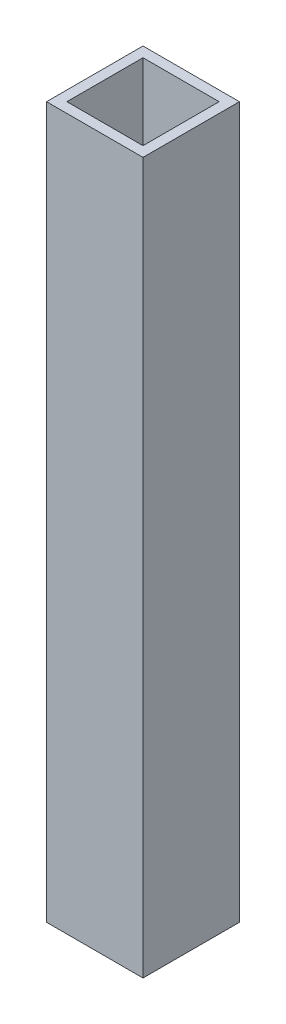
ISO-10303-21;
HEADER;
FILE_DESCRIPTION(('STEP AP214'),'2;1');
FILE_NAME('part.step','',(''),(''),'','','');
FILE_SCHEMA(('AUTOMOTIVE_DESIGN { 1 0 10303 214 1 1 1 1 }'));
ENDSEC;
DATA;
#1=APPLICATION_CONTEXT('core data for automotive mechanical design processes');
#2=APPLICATION_PROTOCOL_DEFINITION('international standard','automotive_design',2000,#1);
#3=PRODUCT_CONTEXT('',#1,'mechanical');
#4=PRODUCT('Part','Part','',(#3));
#5=PRODUCT_RELATED_PRODUCT_CATEGORY('part','',(#4));
#6=PRODUCT_DEFINITION_FORMATION('','',#4);
#7=PRODUCT_DEFINITION_CONTEXT('part definition',#1,'design');
#8=PRODUCT_DEFINITION('design','',#6,#7);
#9=PRODUCT_DEFINITION_SHAPE('','',#8);
#10=(LENGTH_UNIT() NAMED_UNIT(*) SI_UNIT(.MILLI.,.METRE.));
#11=(NAMED_UNIT(*) PLANE_ANGLE_UNIT() SI_UNIT($,.RADIAN.));
#12=(NAMED_UNIT(*) SI_UNIT($,.STERADIAN.) SOLID_ANGLE_UNIT());
#13=UNCERTAINTY_MEASURE_WITH_UNIT(LENGTH_MEASURE(1.E-05),#10,'distance_accuracy_value','');
#14=(GEOMETRIC_REPRESENTATION_CONTEXT(3) GLOBAL_UNCERTAINTY_ASSIGNED_CONTEXT((#13)) GLOBAL_UNIT_ASSIGNED_CONTEXT((#10,
#11,#12)) REPRESENTATION_CONTEXT('',''));
#15=CARTESIAN_POINT('',(0.,0.,0.));
#16=DIRECTION('',(0.,0.,1.));
#17=DIRECTION('',(1.,0.,0.));
#18=AXIS2_PLACEMENT_3D('',#15,#16,#17);
#19=CARTESIAN_POINT('',(0.,140.,0.));
#20=DIRECTION('',(0.,1.,0.));
#21=DIRECTION('',(0.,0.,1.));
#22=AXIS2_PLACEMENT_3D('',#19,#20,#21);
#23=PLANE('',#22);
#24=DIRECTION('',(0.,0.,-1.));
#25=VECTOR('',#24,1.);
#26=CARTESIAN_POINT('',(9.5,140.,9.5));
#27=LINE('',#26,#25);
#28=CARTESIAN_POINT('',(9.5,140.,9.5));
#29=VERTEX_POINT('',#28);
#30=CARTESIAN_POINT('',(9.5,140.,-9.5));
#31=VERTEX_POINT('',#30);
#32=EDGE_CURVE('E181',#29,#31,#27,.T.);
#33=ORIENTED_EDGE('',*,*,#32,.T.);
#34=DIRECTION('',(-1.,0.,0.));
#35=VECTOR('',#34,1.);
#36=CARTESIAN_POINT('',(-9.5,140.,-9.5));
#37=LINE('',#36,#35);
#38=CARTESIAN_POINT('',(-9.5,140.,-9.5));
#39=VERTEX_POINT('',#38);
#40=EDGE_CURVE('E185',#31,#39,#37,.T.);
#41=ORIENTED_EDGE('',*,*,#40,.T.);
#42=DIRECTION('',(0.,0.,1.));
#43=VECTOR('',#42,1.);
#44=CARTESIAN_POINT('',(-9.5,140.,9.5));
#45=LINE('',#44,#43);
#46=CARTESIAN_POINT('',(-9.5,140.,9.5));
#47=VERTEX_POINT('',#46);
#48=EDGE_CURVE('E189',#39,#47,#45,.T.);
#49=ORIENTED_EDGE('',*,*,#48,.T.);
#50=DIRECTION('',(1.,0.,0.));
#51=VECTOR('',#50,1.);
#52=CARTESIAN_POINT('',(-9.5,140.,9.5));
#53=LINE('',#52,#51);
#54=EDGE_CURVE('E192',#47,#29,#53,.T.);
#55=ORIENTED_EDGE('',*,*,#54,.T.);
#56=EDGE_LOOP('',(#33,#41,#49,#55));
#57=FACE_BOUND('',#56,.T.);
#58=DIRECTION('',(-1.,0.,0.));
#59=VECTOR('',#58,1.);
#60=CARTESIAN_POINT('',(0.,140.,-7.5));
#61=LINE('',#60,#59);
#62=CARTESIAN_POINT('',(7.5,140.,-7.5));
#63=VERTEX_POINT('',#62);
#64=CARTESIAN_POINT('',(-7.5,140.,-7.5));
#65=VERTEX_POINT('',#64);
#66=EDGE_CURVE('E142',#63,#65,#61,.T.);
#67=ORIENTED_EDGE('',*,*,#66,.F.);
#68=DIRECTION('',(0.,0.,-1.));
#69=VECTOR('',#68,1.);
#70=CARTESIAN_POINT('',(7.5,140.,0.));
#71=LINE('',#70,#69);
#72=CARTESIAN_POINT('',(7.5,140.,7.5));
#73=VERTEX_POINT('',#72);
#74=EDGE_CURVE('E133',#73,#63,#71,.T.);
#75=ORIENTED_EDGE('',*,*,#74,.F.);
#76=DIRECTION('',(1.,0.,0.));
#77=VECTOR('',#76,1.);
#78=CARTESIAN_POINT('',(0.,140.,7.5));
#79=LINE('',#78,#77);
#80=CARTESIAN_POINT('',(-7.5,140.,7.5));
#81=VERTEX_POINT('',#80);
#82=EDGE_CURVE('E159',#81,#73,#79,.T.);
#83=ORIENTED_EDGE('',*,*,#82,.F.);
#84=DIRECTION('',(0.,0.,1.));
#85=VECTOR('',#84,1.);
#86=CARTESIAN_POINT('',(-7.5,140.,0.));
#87=LINE('',#86,#85);
#88=EDGE_CURVE('E155',#65,#81,#87,.T.);
#89=ORIENTED_EDGE('',*,*,#88,.F.);
#90=EDGE_LOOP('',(#67,#75,#83,#89));
#91=FACE_BOUND('',#90,.T.);
#92=ADVANCED_FACE('F67',(#57,#91),#23,.T.);
#93=CARTESIAN_POINT('',(0.,0.,0.));
#94=DIRECTION('',(0.,1.,0.));
#95=DIRECTION('',(0.,0.,1.));
#96=AXIS2_PLACEMENT_3D('',#93,#94,#95);
#97=PLANE('',#96);
#98=DIRECTION('',(0.,0.,-1.));
#99=VECTOR('',#98,1.);
#100=CARTESIAN_POINT('',(9.5,0.,9.5));
#101=LINE('',#100,#99);
#102=CARTESIAN_POINT('',(9.5,0.,9.5));
#103=VERTEX_POINT('',#102);
#104=CARTESIAN_POINT('',(9.5,0.,-9.5));
#105=VERTEX_POINT('',#104);
#106=EDGE_CURVE('E151',#103,#105,#101,.T.);
#107=ORIENTED_EDGE('',*,*,#106,.F.);
#108=DIRECTION('',(1.,0.,0.));
#109=VECTOR('',#108,1.);
#110=CARTESIAN_POINT('',(-9.5,0.,9.5));
#111=LINE('',#110,#109);
#112=CARTESIAN_POINT('',(-9.5,0.,9.5));
#113=VERTEX_POINT('',#112);
#114=EDGE_CURVE('E186',#113,#103,#111,.T.);
#115=ORIENTED_EDGE('',*,*,#114,.F.);
#116=DIRECTION('',(0.,0.,1.));
#117=VECTOR('',#116,1.);
#118=CARTESIAN_POINT('',(-9.5,0.,9.5));
#119=LINE('',#118,#117);
#120=CARTESIAN_POINT('',(-9.5,0.,-9.5));
#121=VERTEX_POINT('',#120);
#122=EDGE_CURVE('E202',#121,#113,#119,.T.);
#123=ORIENTED_EDGE('',*,*,#122,.F.);
#124=DIRECTION('',(-1.,0.,0.));
#125=VECTOR('',#124,1.);
#126=CARTESIAN_POINT('',(-9.5,0.,-9.5));
#127=LINE('',#126,#125);
#128=EDGE_CURVE('E199',#105,#121,#127,.T.);
#129=ORIENTED_EDGE('',*,*,#128,.F.);
#130=EDGE_LOOP('',(#107,#115,#123,#129));
#131=FACE_BOUND('',#130,.T.);
#132=DIRECTION('',(0.,0.,-1.));
#133=VECTOR('',#132,1.);
#134=CARTESIAN_POINT('',(7.5,0.,0.));
#135=LINE('',#134,#133);
#136=CARTESIAN_POINT('',(7.5,0.,7.5));
#137=VERTEX_POINT('',#136);
#138=CARTESIAN_POINT('',(7.5,0.,-7.5));
#139=VERTEX_POINT('',#138);
#140=EDGE_CURVE('E91',#137,#139,#135,.T.);
#141=ORIENTED_EDGE('',*,*,#140,.T.);
#142=DIRECTION('',(-1.,0.,0.));
#143=VECTOR('',#142,1.);
#144=CARTESIAN_POINT('',(0.,0.,-7.5));
#145=LINE('',#144,#143);
#146=CARTESIAN_POINT('',(-7.5,0.,-7.5));
#147=VERTEX_POINT('',#146);
#148=EDGE_CURVE('E149',#139,#147,#145,.T.);
#149=ORIENTED_EDGE('',*,*,#148,.T.);
#150=DIRECTION('',(0.,0.,1.));
#151=VECTOR('',#150,1.);
#152=CARTESIAN_POINT('',(-7.5,0.,0.));
#153=LINE('',#152,#151);
#154=CARTESIAN_POINT('',(-7.5,0.,7.5));
#155=VERTEX_POINT('',#154);
#156=EDGE_CURVE('E168',#147,#155,#153,.T.);
#157=ORIENTED_EDGE('',*,*,#156,.T.);
#158=DIRECTION('',(1.,0.,0.));
#159=VECTOR('',#158,1.);
#160=CARTESIAN_POINT('',(0.,0.,7.5));
#161=LINE('',#160,#159);
#162=EDGE_CURVE('E143',#155,#137,#161,.T.);
#163=ORIENTED_EDGE('',*,*,#162,.T.);
#164=EDGE_LOOP('',(#141,#149,#157,#163));
#165=FACE_BOUND('',#164,.T.);
#166=ADVANCED_FACE('F225',(#131,#165),#97,.F.);
#167=CARTESIAN_POINT('',(9.5,140.,9.5));
#168=DIRECTION('',(-1.,0.,0.));
#169=DIRECTION('',(0.,0.,1.));
#170=AXIS2_PLACEMENT_3D('',#167,#168,#169);
#171=PLANE('',#170);
#172=ORIENTED_EDGE('',*,*,#106,.T.);
#173=DIRECTION('',(0.,-1.,0.));
#174=VECTOR('',#173,1.);
#175=CARTESIAN_POINT('',(9.5,140.,-9.5));
#176=LINE('',#175,#174);
#177=EDGE_CURVE('E12',#31,#105,#176,.T.);
#178=ORIENTED_EDGE('',*,*,#177,.F.);
#179=ORIENTED_EDGE('',*,*,#32,.F.);
#180=DIRECTION('',(0.,-1.,0.));
#181=VECTOR('',#180,1.);
#182=CARTESIAN_POINT('',(9.5,140.,9.5));
#183=LINE('',#182,#181);
#184=EDGE_CURVE('E195',#29,#103,#183,.T.);
#185=ORIENTED_EDGE('',*,*,#184,.T.);
#186=EDGE_LOOP('',(#172,#178,#179,#185));
#187=FACE_BOUND('',#186,.T.);
#188=ADVANCED_FACE('F69',(#187),#171,.F.);
#189=CARTESIAN_POINT('',(-9.5,140.,-9.5));
#190=DIRECTION('',(0.,0.,1.));
#191=DIRECTION('',(1.,0.,0.));
#192=AXIS2_PLACEMENT_3D('',#189,#190,#191);
#193=PLANE('',#192);
#194=ORIENTED_EDGE('',*,*,#128,.T.);
#195=DIRECTION('',(0.,-1.,0.));
#196=VECTOR('',#195,1.);
#197=CARTESIAN_POINT('',(-9.5,140.,-9.5));
#198=LINE('',#197,#196);
#199=EDGE_CURVE('E76',#39,#121,#198,.T.);
#200=ORIENTED_EDGE('',*,*,#199,.F.);
#201=ORIENTED_EDGE('',*,*,#40,.F.);
#202=ORIENTED_EDGE('',*,*,#177,.T.);
#203=EDGE_LOOP('',(#194,#200,#201,#202));
#204=FACE_BOUND('',#203,.T.);
#205=ADVANCED_FACE('F235',(#204),#193,.F.);
#206=CARTESIAN_POINT('',(-9.5,140.,9.5));
#207=DIRECTION('',(1.,0.,0.));
#208=DIRECTION('',(0.,0.,-1.));
#209=AXIS2_PLACEMENT_3D('',#206,#207,#208);
#210=PLANE('',#209);
#211=ORIENTED_EDGE('',*,*,#122,.T.);
#212=DIRECTION('',(0.,-1.,0.));
#213=VECTOR('',#212,1.);
#214=CARTESIAN_POINT('',(-9.5,140.,9.5));
#215=LINE('',#214,#213);
#216=EDGE_CURVE('E210',#47,#113,#215,.T.);
#217=ORIENTED_EDGE('',*,*,#216,.F.);
#218=ORIENTED_EDGE('',*,*,#48,.F.);
#219=ORIENTED_EDGE('',*,*,#199,.T.);
#220=EDGE_LOOP('',(#211,#217,#218,#219));
#221=FACE_BOUND('',#220,.T.);
#222=ADVANCED_FACE('F219',(#221),#210,.F.);
#223=CARTESIAN_POINT('',(-9.5,140.,9.5));
#224=DIRECTION('',(0.,0.,-1.));
#225=DIRECTION('',(-1.,0.,0.));
#226=AXIS2_PLACEMENT_3D('',#223,#224,#225);
#227=PLANE('',#226);
#228=ORIENTED_EDGE('',*,*,#114,.T.);
#229=ORIENTED_EDGE('',*,*,#184,.F.);
#230=ORIENTED_EDGE('',*,*,#54,.F.);
#231=ORIENTED_EDGE('',*,*,#216,.T.);
#232=EDGE_LOOP('',(#228,#229,#230,#231));
#233=FACE_BOUND('',#232,.T.);
#234=ADVANCED_FACE('F229',(#233),#227,.F.);
#235=CARTESIAN_POINT('',(7.5,140.,0.));
#236=DIRECTION('',(-1.,0.,0.));
#237=DIRECTION('',(0.,0.,1.));
#238=AXIS2_PLACEMENT_3D('',#235,#236,#237);
#239=PLANE('',#238);
#240=ORIENTED_EDGE('',*,*,#140,.F.);
#241=DIRECTION('',(0.,-1.,0.));
#242=VECTOR('',#241,1.);
#243=CARTESIAN_POINT('',(7.5,140.,7.5));
#244=LINE('',#243,#242);
#245=EDGE_CURVE('E137',#73,#137,#244,.T.);
#246=ORIENTED_EDGE('',*,*,#245,.F.);
#247=ORIENTED_EDGE('',*,*,#74,.T.);
#248=DIRECTION('',(0.,-1.,0.));
#249=VECTOR('',#248,1.);
#250=CARTESIAN_POINT('',(7.5,140.,-7.5));
#251=LINE('',#250,#249);
#252=EDGE_CURVE('E136',#63,#139,#251,.T.);
#253=ORIENTED_EDGE('',*,*,#252,.T.);
#254=EDGE_LOOP('',(#240,#246,#247,#253));
#255=FACE_BOUND('',#254,.T.);
#256=ADVANCED_FACE('F135',(#255),#239,.T.);
#257=CARTESIAN_POINT('',(0.,140.,-7.5));
#258=DIRECTION('',(0.,0.,1.));
#259=DIRECTION('',(1.,0.,0.));
#260=AXIS2_PLACEMENT_3D('',#257,#258,#259);
#261=PLANE('',#260);
#262=ORIENTED_EDGE('',*,*,#148,.F.);
#263=ORIENTED_EDGE('',*,*,#252,.F.);
#264=ORIENTED_EDGE('',*,*,#66,.T.);
#265=DIRECTION('',(0.,-1.,0.));
#266=VECTOR('',#265,1.);
#267=CARTESIAN_POINT('',(-7.5,140.,-7.5));
#268=LINE('',#267,#266);
#269=EDGE_CURVE('E152',#65,#147,#268,.T.);
#270=ORIENTED_EDGE('',*,*,#269,.T.);
#271=EDGE_LOOP('',(#262,#263,#264,#270));
#272=FACE_BOUND('',#271,.T.);
#273=ADVANCED_FACE('F146',(#272),#261,.T.);
#274=CARTESIAN_POINT('',(-7.5,140.,0.));
#275=DIRECTION('',(1.,0.,0.));
#276=DIRECTION('',(0.,0.,-1.));
#277=AXIS2_PLACEMENT_3D('',#274,#275,#276);
#278=PLANE('',#277);
#279=ORIENTED_EDGE('',*,*,#156,.F.);
#280=ORIENTED_EDGE('',*,*,#269,.F.);
#281=ORIENTED_EDGE('',*,*,#88,.T.);
#282=DIRECTION('',(0.,-1.,0.));
#283=VECTOR('',#282,1.);
#284=CARTESIAN_POINT('',(-7.5,140.,7.5));
#285=LINE('',#284,#283);
#286=EDGE_CURVE('E83',#81,#155,#285,.T.);
#287=ORIENTED_EDGE('',*,*,#286,.T.);
#288=EDGE_LOOP('',(#279,#280,#281,#287));
#289=FACE_BOUND('',#288,.T.);
#290=ADVANCED_FACE('F258',(#289),#278,.T.);
#291=CARTESIAN_POINT('',(0.,140.,7.5));
#292=DIRECTION('',(0.,0.,-1.));
#293=DIRECTION('',(-1.,0.,0.));
#294=AXIS2_PLACEMENT_3D('',#291,#292,#293);
#295=PLANE('',#294);
#296=ORIENTED_EDGE('',*,*,#162,.F.);
#297=ORIENTED_EDGE('',*,*,#286,.F.);
#298=ORIENTED_EDGE('',*,*,#82,.T.);
#299=ORIENTED_EDGE('',*,*,#245,.T.);
#300=EDGE_LOOP('',(#296,#297,#298,#299));
#301=FACE_BOUND('',#300,.T.);
#302=ADVANCED_FACE('F262',(#301),#295,.T.);
#303=CLOSED_SHELL('',(#92,#166,#188,#205,#222,#234,#256,#273,#290,#302));
#304=MANIFOLD_SOLID_BREP('B2',#303);
#305=ADVANCED_BREP_SHAPE_REPRESENTATION('',(#18,#304),#14);
#306=SHAPE_DEFINITION_REPRESENTATION(#9,#305);
ENDSEC;
END-ISO-10303-21;
